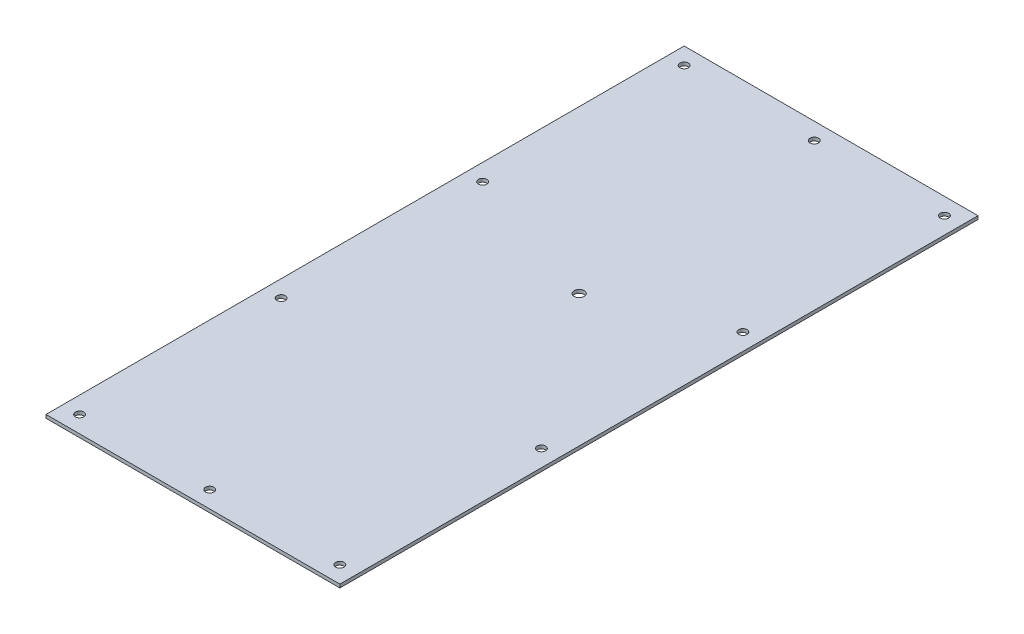
ISO-10303-21;
HEADER;
FILE_DESCRIPTION(('STEP AP214'),'2;1');
FILE_NAME('part.step','',(''),(''),'','','');
FILE_SCHEMA(('AUTOMOTIVE_DESIGN { 1 0 10303 214 1 1 1 1 }'));
ENDSEC;
DATA;
#1=APPLICATION_CONTEXT('core data for automotive mechanical design processes');
#2=APPLICATION_PROTOCOL_DEFINITION('international standard','automotive_design',2000,#1);
#3=PRODUCT_CONTEXT('',#1,'mechanical');
#4=PRODUCT('Part','Part','',(#3));
#5=PRODUCT_RELATED_PRODUCT_CATEGORY('part','',(#4));
#6=PRODUCT_DEFINITION_FORMATION('','',#4);
#7=PRODUCT_DEFINITION_CONTEXT('part definition',#1,'design');
#8=PRODUCT_DEFINITION('design','',#6,#7);
#9=PRODUCT_DEFINITION_SHAPE('','',#8);
#10=(LENGTH_UNIT() NAMED_UNIT(*) SI_UNIT(.MILLI.,.METRE.));
#11=(NAMED_UNIT(*) PLANE_ANGLE_UNIT() SI_UNIT($,.RADIAN.));
#12=(NAMED_UNIT(*) SI_UNIT($,.STERADIAN.) SOLID_ANGLE_UNIT());
#13=UNCERTAINTY_MEASURE_WITH_UNIT(LENGTH_MEASURE(1.E-05),#10,'distance_accuracy_value','');
#14=(GEOMETRIC_REPRESENTATION_CONTEXT(3) GLOBAL_UNCERTAINTY_ASSIGNED_CONTEXT((#13)) GLOBAL_UNIT_ASSIGNED_CONTEXT((#10,
#11,#12)) REPRESENTATION_CONTEXT('',''));
#15=CARTESIAN_POINT('',(0.,0.,0.));
#16=DIRECTION('',(0.,0.,1.));
#17=DIRECTION('',(1.,0.,0.));
#18=AXIS2_PLACEMENT_3D('',#15,#16,#17);
#19=CARTESIAN_POINT('',(0.,2.,0.));
#20=DIRECTION('',(0.,1.,0.));
#21=DIRECTION('',(0.,0.,1.));
#22=AXIS2_PLACEMENT_3D('',#19,#20,#21);
#23=PLANE('',#22);
#24=CARTESIAN_POINT('',(8.89694413375075,2.,-31.1063946306831));
#25=DIRECTION('',(0.,1.,0.));
#26=DIRECTION('',(0.,0.,1.));
#27=AXIS2_PLACEMENT_3D('',#24,#25,#26);
#28=CIRCLE('',#27,3.);
#29=CARTESIAN_POINT('',(8.89694413375075,2.,-28.1063946306831));
#30=VERTEX_POINT('',#29);
#31=EDGE_CURVE('E172',#30,#30,#28,.T.);
#32=ORIENTED_EDGE('',*,*,#31,.F.);
#33=EDGE_LOOP('',(#32));
#34=FACE_BOUND('',#33,.T.);
#35=CARTESIAN_POINT('',(-77.4999999999975,2.,60.));
#36=DIRECTION('',(0.,1.,0.));
#37=DIRECTION('',(0.,0.,1.));
#38=AXIS2_PLACEMENT_3D('',#35,#36,#37);
#39=CIRCLE('',#38,2.50000000000001);
#40=CARTESIAN_POINT('',(-77.4999999999975,2.,62.5));
#41=VERTEX_POINT('',#40);
#42=EDGE_CURVE('E157',#41,#41,#39,.T.);
#43=ORIENTED_EDGE('',*,*,#42,.F.);
#44=EDGE_LOOP('',(#43));
#45=FACE_BOUND('',#44,.T.);
#46=CARTESIAN_POINT('',(77.5000000000038,2.,180.));
#47=DIRECTION('',(0.,1.,0.));
#48=DIRECTION('',(0.,0.,1.));
#49=AXIS2_PLACEMENT_3D('',#46,#47,#48);
#50=CIRCLE('',#49,2.50000000000001);
#51=CARTESIAN_POINT('',(77.5000000000038,2.,182.5));
#52=VERTEX_POINT('',#51);
#53=EDGE_CURVE('E145',#52,#52,#50,.T.);
#54=ORIENTED_EDGE('',*,*,#53,.F.);
#55=EDGE_LOOP('',(#54));
#56=FACE_BOUND('',#55,.T.);
#57=CARTESIAN_POINT('',(77.5000000000026,2.,60.));
#58=DIRECTION('',(0.,1.,0.));
#59=DIRECTION('',(0.,0.,1.));
#60=AXIS2_PLACEMENT_3D('',#57,#58,#59);
#61=CIRCLE('',#60,2.50000000000001);
#62=CARTESIAN_POINT('',(77.5000000000026,2.,62.5));
#63=VERTEX_POINT('',#62);
#64=EDGE_CURVE('E133',#63,#63,#61,.T.);
#65=ORIENTED_EDGE('',*,*,#64,.F.);
#66=EDGE_LOOP('',(#65));
#67=FACE_BOUND('',#66,.T.);
#68=CARTESIAN_POINT('',(77.5,2.,-180.));
#69=DIRECTION('',(0.,1.,0.));
#70=DIRECTION('',(0.,0.,1.));
#71=AXIS2_PLACEMENT_3D('',#68,#69,#70);
#72=CIRCLE('',#71,2.50000000000001);
#73=CARTESIAN_POINT('',(77.5,2.,-177.5));
#74=VERTEX_POINT('',#73);
#75=EDGE_CURVE('E121',#74,#74,#72,.T.);
#76=ORIENTED_EDGE('',*,*,#75,.F.);
#77=EDGE_LOOP('',(#76));
#78=FACE_BOUND('',#77,.T.);
#79=CARTESIAN_POINT('',(-77.5,2.,-180.));
#80=DIRECTION('',(0.,1.,0.));
#81=DIRECTION('',(0.,0.,1.));
#82=AXIS2_PLACEMENT_3D('',#79,#80,#81);
#83=CIRCLE('',#82,2.50000000000001);
#84=CARTESIAN_POINT('',(-77.5,2.,-177.5));
#85=VERTEX_POINT('',#84);
#86=EDGE_CURVE('E100',#85,#85,#83,.T.);
#87=ORIENTED_EDGE('',*,*,#86,.F.);
#88=EDGE_LOOP('',(#87));
#89=FACE_BOUND('',#88,.T.);
#90=DIRECTION('',(0.,0.,1.));
#91=VECTOR('',#90,1.);
#92=CARTESIAN_POINT('',(-87.5,2.,190.));
#93=LINE('',#92,#91);
#94=CARTESIAN_POINT('',(-87.5,2.,-190.));
#95=VERTEX_POINT('',#94);
#96=CARTESIAN_POINT('',(-87.5,2.,190.));
#97=VERTEX_POINT('',#96);
#98=EDGE_CURVE('E85',#95,#97,#93,.T.);
#99=ORIENTED_EDGE('',*,*,#98,.T.);
#100=DIRECTION('',(1.,0.,0.));
#101=VECTOR('',#100,1.);
#102=CARTESIAN_POINT('',(87.5,2.,190.));
#103=LINE('',#102,#101);
#104=CARTESIAN_POINT('',(87.5,2.,190.));
#105=VERTEX_POINT('',#104);
#106=EDGE_CURVE('E80',#97,#105,#103,.T.);
#107=ORIENTED_EDGE('',*,*,#106,.T.);
#108=DIRECTION('',(0.,0.,-1.));
#109=VECTOR('',#108,1.);
#110=CARTESIAN_POINT('',(87.5,2.,190.));
#111=LINE('',#110,#109);
#112=CARTESIAN_POINT('',(87.5,2.,-190.));
#113=VERTEX_POINT('',#112);
#114=EDGE_CURVE('E83',#105,#113,#111,.T.);
#115=ORIENTED_EDGE('',*,*,#114,.T.);
#116=DIRECTION('',(-1.,0.,0.));
#117=VECTOR('',#116,1.);
#118=CARTESIAN_POINT('',(87.5,2.,-190.));
#119=LINE('',#118,#117);
#120=EDGE_CURVE('E50',#113,#95,#119,.T.);
#121=ORIENTED_EDGE('',*,*,#120,.T.);
#122=EDGE_LOOP('',(#99,#107,#115,#121));
#123=FACE_BOUND('',#122,.T.);
#124=CARTESIAN_POINT('',(0.,2.,-180.));
#125=DIRECTION('',(0.,1.,0.));
#126=DIRECTION('',(0.,0.,1.));
#127=AXIS2_PLACEMENT_3D('',#124,#125,#126);
#128=CIRCLE('',#127,2.50000000000001);
#129=CARTESIAN_POINT('',(0.,2.,-177.5));
#130=VERTEX_POINT('',#129);
#131=EDGE_CURVE('E115',#130,#130,#128,.T.);
#132=ORIENTED_EDGE('',*,*,#131,.F.);
#133=EDGE_LOOP('',(#132));
#134=FACE_BOUND('',#133,.T.);
#135=CARTESIAN_POINT('',(77.5000000000013,2.,-60.));
#136=DIRECTION('',(0.,1.,0.));
#137=DIRECTION('',(0.,0.,1.));
#138=AXIS2_PLACEMENT_3D('',#135,#136,#137);
#139=CIRCLE('',#138,2.50000000000001);
#140=CARTESIAN_POINT('',(77.5000000000013,2.,-57.5));
#141=VERTEX_POINT('',#140);
#142=EDGE_CURVE('E127',#141,#141,#139,.T.);
#143=ORIENTED_EDGE('',*,*,#142,.F.);
#144=EDGE_LOOP('',(#143));
#145=FACE_BOUND('',#144,.T.);
#146=CARTESIAN_POINT('',(3.80251385934116E-12,2.,180.));
#147=DIRECTION('',(0.,1.,0.));
#148=DIRECTION('',(0.,0.,1.));
#149=AXIS2_PLACEMENT_3D('',#146,#147,#148);
#150=CIRCLE('',#149,2.50000000000001);
#151=CARTESIAN_POINT('',(3.80251385934116E-12,2.,182.5));
#152=VERTEX_POINT('',#151);
#153=EDGE_CURVE('E139',#152,#152,#150,.T.);
#154=ORIENTED_EDGE('',*,*,#153,.F.);
#155=EDGE_LOOP('',(#154));
#156=FACE_BOUND('',#155,.T.);
#157=CARTESIAN_POINT('',(-77.4999999999987,2.,-60.));
#158=DIRECTION('',(0.,1.,0.));
#159=DIRECTION('',(0.,0.,1.));
#160=AXIS2_PLACEMENT_3D('',#157,#158,#159);
#161=CIRCLE('',#160,2.50000000000001);
#162=CARTESIAN_POINT('',(-77.4999999999987,2.,-57.5));
#163=VERTEX_POINT('',#162);
#164=EDGE_CURVE('E151',#163,#163,#161,.T.);
#165=ORIENTED_EDGE('',*,*,#164,.F.);
#166=EDGE_LOOP('',(#165));
#167=FACE_BOUND('',#166,.T.);
#168=CARTESIAN_POINT('',(-77.4999999999962,2.,180.));
#169=DIRECTION('',(0.,1.,0.));
#170=DIRECTION('',(0.,0.,1.));
#171=AXIS2_PLACEMENT_3D('',#168,#169,#170);
#172=CIRCLE('',#171,2.50000000000001);
#173=CARTESIAN_POINT('',(-77.4999999999962,2.,182.5));
#174=VERTEX_POINT('',#173);
#175=EDGE_CURVE('E163',#174,#174,#172,.T.);
#176=ORIENTED_EDGE('',*,*,#175,.F.);
#177=EDGE_LOOP('',(#176));
#178=FACE_BOUND('',#177,.T.);
#179=ADVANCED_FACE('F33',(#34,#45,#56,#67,#78,#89,#123,#134,#145,#156,#167,#178),#23,.T.);
#180=CARTESIAN_POINT('',(0.,0.,0.));
#181=DIRECTION('',(0.,1.,0.));
#182=DIRECTION('',(0.,0.,1.));
#183=AXIS2_PLACEMENT_3D('',#180,#181,#182);
#184=PLANE('',#183);
#185=CARTESIAN_POINT('',(8.89694413375075,0.,-31.1063946306831));
#186=DIRECTION('',(0.,1.,0.));
#187=DIRECTION('',(0.,0.,1.));
#188=AXIS2_PLACEMENT_3D('',#185,#186,#187);
#189=CIRCLE('',#188,3.);
#190=CARTESIAN_POINT('',(8.89694413375075,0.,-28.1063946306831));
#191=VERTEX_POINT('',#190);
#192=EDGE_CURVE('E169',#191,#191,#189,.T.);
#193=ORIENTED_EDGE('',*,*,#192,.T.);
#194=EDGE_LOOP('',(#193));
#195=FACE_BOUND('',#194,.T.);
#196=DIRECTION('',(0.,0.,1.));
#197=VECTOR('',#196,1.);
#198=CARTESIAN_POINT('',(-87.5,0.,190.));
#199=LINE('',#198,#197);
#200=CARTESIAN_POINT('',(-87.5,0.,-190.));
#201=VERTEX_POINT('',#200);
#202=CARTESIAN_POINT('',(-87.5,0.,190.));
#203=VERTEX_POINT('',#202);
#204=EDGE_CURVE('E97',#201,#203,#199,.T.);
#205=ORIENTED_EDGE('',*,*,#204,.F.);
#206=DIRECTION('',(-1.,0.,0.));
#207=VECTOR('',#206,1.);
#208=CARTESIAN_POINT('',(87.5,0.,-190.));
#209=LINE('',#208,#207);
#210=CARTESIAN_POINT('',(87.5,0.,-190.));
#211=VERTEX_POINT('',#210);
#212=EDGE_CURVE('E73',#211,#201,#209,.T.);
#213=ORIENTED_EDGE('',*,*,#212,.F.);
#214=DIRECTION('',(0.,0.,-1.));
#215=VECTOR('',#214,1.);
#216=CARTESIAN_POINT('',(87.5,0.,190.));
#217=LINE('',#216,#215);
#218=CARTESIAN_POINT('',(87.5,0.,190.));
#219=VERTEX_POINT('',#218);
#220=EDGE_CURVE('E67',#219,#211,#217,.T.);
#221=ORIENTED_EDGE('',*,*,#220,.F.);
#222=DIRECTION('',(1.,0.,0.));
#223=VECTOR('',#222,1.);
#224=CARTESIAN_POINT('',(87.5,0.,190.));
#225=LINE('',#224,#223);
#226=EDGE_CURVE('E89',#203,#219,#225,.T.);
#227=ORIENTED_EDGE('',*,*,#226,.F.);
#228=EDGE_LOOP('',(#205,#213,#221,#227));
#229=FACE_BOUND('',#228,.T.);
#230=CARTESIAN_POINT('',(-77.5,0.,-180.));
#231=DIRECTION('',(0.,1.,0.));
#232=DIRECTION('',(0.,0.,1.));
#233=AXIS2_PLACEMENT_3D('',#230,#231,#232);
#234=CIRCLE('',#233,2.50000000000001);
#235=CARTESIAN_POINT('',(-77.5,0.,-177.5));
#236=VERTEX_POINT('',#235);
#237=EDGE_CURVE('E112',#236,#236,#234,.T.);
#238=ORIENTED_EDGE('',*,*,#237,.T.);
#239=EDGE_LOOP('',(#238));
#240=FACE_BOUND('',#239,.T.);
#241=CARTESIAN_POINT('',(0.,0.,-180.));
#242=DIRECTION('',(0.,1.,0.));
#243=DIRECTION('',(0.,0.,1.));
#244=AXIS2_PLACEMENT_3D('',#241,#242,#243);
#245=CIRCLE('',#244,2.50000000000001);
#246=CARTESIAN_POINT('',(0.,0.,-177.5));
#247=VERTEX_POINT('',#246);
#248=EDGE_CURVE('E118',#247,#247,#245,.T.);
#249=ORIENTED_EDGE('',*,*,#248,.T.);
#250=EDGE_LOOP('',(#249));
#251=FACE_BOUND('',#250,.T.);
#252=CARTESIAN_POINT('',(77.5,0.,-180.));
#253=DIRECTION('',(0.,1.,0.));
#254=DIRECTION('',(0.,0.,1.));
#255=AXIS2_PLACEMENT_3D('',#252,#253,#254);
#256=CIRCLE('',#255,2.50000000000001);
#257=CARTESIAN_POINT('',(77.5,0.,-177.5));
#258=VERTEX_POINT('',#257);
#259=EDGE_CURVE('E124',#258,#258,#256,.T.);
#260=ORIENTED_EDGE('',*,*,#259,.T.);
#261=EDGE_LOOP('',(#260));
#262=FACE_BOUND('',#261,.T.);
#263=CARTESIAN_POINT('',(77.5000000000013,0.,-60.));
#264=DIRECTION('',(0.,1.,0.));
#265=DIRECTION('',(0.,0.,1.));
#266=AXIS2_PLACEMENT_3D('',#263,#264,#265);
#267=CIRCLE('',#266,2.50000000000001);
#268=CARTESIAN_POINT('',(77.5000000000013,0.,-57.5));
#269=VERTEX_POINT('',#268);
#270=EDGE_CURVE('E130',#269,#269,#267,.T.);
#271=ORIENTED_EDGE('',*,*,#270,.T.);
#272=EDGE_LOOP('',(#271));
#273=FACE_BOUND('',#272,.T.);
#274=CARTESIAN_POINT('',(77.5000000000026,0.,60.));
#275=DIRECTION('',(0.,1.,0.));
#276=DIRECTION('',(0.,0.,1.));
#277=AXIS2_PLACEMENT_3D('',#274,#275,#276);
#278=CIRCLE('',#277,2.50000000000001);
#279=CARTESIAN_POINT('',(77.5000000000026,0.,62.5));
#280=VERTEX_POINT('',#279);
#281=EDGE_CURVE('E136',#280,#280,#278,.T.);
#282=ORIENTED_EDGE('',*,*,#281,.T.);
#283=EDGE_LOOP('',(#282));
#284=FACE_BOUND('',#283,.T.);
#285=CARTESIAN_POINT('',(3.80251385934116E-12,0.,180.));
#286=DIRECTION('',(0.,1.,0.));
#287=DIRECTION('',(0.,0.,1.));
#288=AXIS2_PLACEMENT_3D('',#285,#286,#287);
#289=CIRCLE('',#288,2.50000000000001);
#290=CARTESIAN_POINT('',(3.80251385934116E-12,0.,182.5));
#291=VERTEX_POINT('',#290);
#292=EDGE_CURVE('E142',#291,#291,#289,.T.);
#293=ORIENTED_EDGE('',*,*,#292,.T.);
#294=EDGE_LOOP('',(#293));
#295=FACE_BOUND('',#294,.T.);
#296=CARTESIAN_POINT('',(77.5000000000038,0.,180.));
#297=DIRECTION('',(0.,1.,0.));
#298=DIRECTION('',(0.,0.,1.));
#299=AXIS2_PLACEMENT_3D('',#296,#297,#298);
#300=CIRCLE('',#299,2.50000000000001);
#301=CARTESIAN_POINT('',(77.5000000000038,0.,182.5));
#302=VERTEX_POINT('',#301);
#303=EDGE_CURVE('E148',#302,#302,#300,.T.);
#304=ORIENTED_EDGE('',*,*,#303,.T.);
#305=EDGE_LOOP('',(#304));
#306=FACE_BOUND('',#305,.T.);
#307=CARTESIAN_POINT('',(-77.4999999999987,0.,-60.));
#308=DIRECTION('',(0.,1.,0.));
#309=DIRECTION('',(0.,0.,1.));
#310=AXIS2_PLACEMENT_3D('',#307,#308,#309);
#311=CIRCLE('',#310,2.50000000000001);
#312=CARTESIAN_POINT('',(-77.4999999999987,0.,-57.5));
#313=VERTEX_POINT('',#312);
#314=EDGE_CURVE('E154',#313,#313,#311,.T.);
#315=ORIENTED_EDGE('',*,*,#314,.T.);
#316=EDGE_LOOP('',(#315));
#317=FACE_BOUND('',#316,.T.);
#318=CARTESIAN_POINT('',(-77.4999999999975,0.,60.));
#319=DIRECTION('',(0.,1.,0.));
#320=DIRECTION('',(0.,0.,1.));
#321=AXIS2_PLACEMENT_3D('',#318,#319,#320);
#322=CIRCLE('',#321,2.50000000000001);
#323=CARTESIAN_POINT('',(-77.4999999999975,0.,62.5));
#324=VERTEX_POINT('',#323);
#325=EDGE_CURVE('E160',#324,#324,#322,.T.);
#326=ORIENTED_EDGE('',*,*,#325,.T.);
#327=EDGE_LOOP('',(#326));
#328=FACE_BOUND('',#327,.T.);
#329=CARTESIAN_POINT('',(-77.4999999999962,0.,180.));
#330=DIRECTION('',(0.,1.,0.));
#331=DIRECTION('',(0.,0.,1.));
#332=AXIS2_PLACEMENT_3D('',#329,#330,#331);
#333=CIRCLE('',#332,2.50000000000001);
#334=CARTESIAN_POINT('',(-77.4999999999962,0.,182.5));
#335=VERTEX_POINT('',#334);
#336=EDGE_CURVE('E166',#335,#335,#333,.T.);
#337=ORIENTED_EDGE('',*,*,#336,.T.);
#338=EDGE_LOOP('',(#337));
#339=FACE_BOUND('',#338,.T.);
#340=ADVANCED_FACE('F108',(#195,#229,#240,#251,#262,#273,#284,#295,#306,#317,#328,#339),#184,.F.);
#341=CARTESIAN_POINT('',(-87.5,2.,190.));
#342=DIRECTION('',(1.,0.,0.));
#343=DIRECTION('',(0.,0.,-1.));
#344=AXIS2_PLACEMENT_3D('',#341,#342,#343);
#345=PLANE('',#344);
#346=ORIENTED_EDGE('',*,*,#204,.T.);
#347=DIRECTION('',(0.,-1.,0.));
#348=VECTOR('',#347,1.);
#349=CARTESIAN_POINT('',(-87.5,2.,190.));
#350=LINE('',#349,#348);
#351=EDGE_CURVE('E11',#97,#203,#350,.T.);
#352=ORIENTED_EDGE('',*,*,#351,.F.);
#353=ORIENTED_EDGE('',*,*,#98,.F.);
#354=DIRECTION('',(0.,-1.,0.));
#355=VECTOR('',#354,1.);
#356=CARTESIAN_POINT('',(-87.5,2.,-190.));
#357=LINE('',#356,#355);
#358=EDGE_CURVE('E93',#95,#201,#357,.T.);
#359=ORIENTED_EDGE('',*,*,#358,.T.);
#360=EDGE_LOOP('',(#346,#352,#353,#359));
#361=FACE_BOUND('',#360,.T.);
#362=ADVANCED_FACE('F35',(#361),#345,.F.);
#363=CARTESIAN_POINT('',(87.5,2.,190.));
#364=DIRECTION('',(0.,0.,-1.));
#365=DIRECTION('',(-1.,0.,0.));
#366=AXIS2_PLACEMENT_3D('',#363,#364,#365);
#367=PLANE('',#366);
#368=ORIENTED_EDGE('',*,*,#226,.T.);
#369=DIRECTION('',(0.,-1.,0.));
#370=VECTOR('',#369,1.);
#371=CARTESIAN_POINT('',(87.5,2.,190.));
#372=LINE('',#371,#370);
#373=EDGE_CURVE('E42',#105,#219,#372,.T.);
#374=ORIENTED_EDGE('',*,*,#373,.F.);
#375=ORIENTED_EDGE('',*,*,#106,.F.);
#376=ORIENTED_EDGE('',*,*,#351,.T.);
#377=EDGE_LOOP('',(#368,#374,#375,#376));
#378=FACE_BOUND('',#377,.T.);
#379=ADVANCED_FACE('F88',(#378),#367,.F.);
#380=CARTESIAN_POINT('',(87.5,2.,190.));
#381=DIRECTION('',(-1.,0.,0.));
#382=DIRECTION('',(0.,0.,1.));
#383=AXIS2_PLACEMENT_3D('',#380,#381,#382);
#384=PLANE('',#383);
#385=ORIENTED_EDGE('',*,*,#220,.T.);
#386=DIRECTION('',(0.,-1.,0.));
#387=VECTOR('',#386,1.);
#388=CARTESIAN_POINT('',(87.5,2.,-190.));
#389=LINE('',#388,#387);
#390=EDGE_CURVE('E90',#113,#211,#389,.T.);
#391=ORIENTED_EDGE('',*,*,#390,.F.);
#392=ORIENTED_EDGE('',*,*,#114,.F.);
#393=ORIENTED_EDGE('',*,*,#373,.T.);
#394=EDGE_LOOP('',(#385,#391,#392,#393));
#395=FACE_BOUND('',#394,.T.);
#396=ADVANCED_FACE('F91',(#395),#384,.F.);
#397=CARTESIAN_POINT('',(87.5,2.,-190.));
#398=DIRECTION('',(0.,0.,1.));
#399=DIRECTION('',(1.,0.,0.));
#400=AXIS2_PLACEMENT_3D('',#397,#398,#399);
#401=PLANE('',#400);
#402=ORIENTED_EDGE('',*,*,#212,.T.);
#403=ORIENTED_EDGE('',*,*,#358,.F.);
#404=ORIENTED_EDGE('',*,*,#120,.F.);
#405=ORIENTED_EDGE('',*,*,#390,.T.);
#406=EDGE_LOOP('',(#402,#403,#404,#405));
#407=FACE_BOUND('',#406,.T.);
#408=ADVANCED_FACE('F105',(#407),#401,.F.);
#409=CARTESIAN_POINT('',(-77.5,2.,-180.));
#410=DIRECTION('',(0.,-1.,0.));
#411=DIRECTION('',(0.,0.,-1.));
#412=AXIS2_PLACEMENT_3D('',#409,#410,#411);
#413=CYLINDRICAL_SURFACE('',#412,2.50000000000001);
#414=ORIENTED_EDGE('',*,*,#86,.T.);
#415=EDGE_LOOP('',(#414));
#416=FACE_BOUND('',#415,.T.);
#417=ORIENTED_EDGE('',*,*,#237,.F.);
#418=EDGE_LOOP('',(#417));
#419=FACE_BOUND('',#418,.T.);
#420=ADVANCED_FACE('F199',(#416,#419),#413,.F.);
#421=CARTESIAN_POINT('',(0.,2.,-180.));
#422=DIRECTION('',(0.,-1.,0.));
#423=DIRECTION('',(0.,0.,-1.));
#424=AXIS2_PLACEMENT_3D('',#421,#422,#423);
#425=CYLINDRICAL_SURFACE('',#424,2.50000000000001);
#426=ORIENTED_EDGE('',*,*,#131,.T.);
#427=EDGE_LOOP('',(#426));
#428=FACE_BOUND('',#427,.T.);
#429=ORIENTED_EDGE('',*,*,#248,.F.);
#430=EDGE_LOOP('',(#429));
#431=FACE_BOUND('',#430,.T.);
#432=ADVANCED_FACE('F202',(#428,#431),#425,.F.);
#433=CARTESIAN_POINT('',(77.5,2.,-180.));
#434=DIRECTION('',(0.,-1.,0.));
#435=DIRECTION('',(0.,0.,-1.));
#436=AXIS2_PLACEMENT_3D('',#433,#434,#435);
#437=CYLINDRICAL_SURFACE('',#436,2.50000000000001);
#438=ORIENTED_EDGE('',*,*,#75,.T.);
#439=EDGE_LOOP('',(#438));
#440=FACE_BOUND('',#439,.T.);
#441=ORIENTED_EDGE('',*,*,#259,.F.);
#442=EDGE_LOOP('',(#441));
#443=FACE_BOUND('',#442,.T.);
#444=ADVANCED_FACE('F255',(#440,#443),#437,.F.);
#445=CARTESIAN_POINT('',(77.5000000000013,2.,-60.));
#446=DIRECTION('',(0.,-1.,0.));
#447=DIRECTION('',(0.,0.,-1.));
#448=AXIS2_PLACEMENT_3D('',#445,#446,#447);
#449=CYLINDRICAL_SURFACE('',#448,2.50000000000001);
#450=ORIENTED_EDGE('',*,*,#142,.T.);
#451=EDGE_LOOP('',(#450));
#452=FACE_BOUND('',#451,.T.);
#453=ORIENTED_EDGE('',*,*,#270,.F.);
#454=EDGE_LOOP('',(#453));
#455=FACE_BOUND('',#454,.T.);
#456=ADVANCED_FACE('F251',(#452,#455),#449,.F.);
#457=CARTESIAN_POINT('',(77.5000000000026,2.,60.));
#458=DIRECTION('',(0.,-1.,0.));
#459=DIRECTION('',(0.,0.,-1.));
#460=AXIS2_PLACEMENT_3D('',#457,#458,#459);
#461=CYLINDRICAL_SURFACE('',#460,2.50000000000001);
#462=ORIENTED_EDGE('',*,*,#64,.T.);
#463=EDGE_LOOP('',(#462));
#464=FACE_BOUND('',#463,.T.);
#465=ORIENTED_EDGE('',*,*,#281,.F.);
#466=EDGE_LOOP('',(#465));
#467=FACE_BOUND('',#466,.T.);
#468=ADVANCED_FACE('F247',(#464,#467),#461,.F.);
#469=CARTESIAN_POINT('',(3.80251385934116E-12,2.,180.));
#470=DIRECTION('',(0.,-1.,0.));
#471=DIRECTION('',(0.,0.,-1.));
#472=AXIS2_PLACEMENT_3D('',#469,#470,#471);
#473=CYLINDRICAL_SURFACE('',#472,2.50000000000001);
#474=ORIENTED_EDGE('',*,*,#153,.T.);
#475=EDGE_LOOP('',(#474));
#476=FACE_BOUND('',#475,.T.);
#477=ORIENTED_EDGE('',*,*,#292,.F.);
#478=EDGE_LOOP('',(#477));
#479=FACE_BOUND('',#478,.T.);
#480=ADVANCED_FACE('F243',(#476,#479),#473,.F.);
#481=CARTESIAN_POINT('',(77.5000000000038,2.,180.));
#482=DIRECTION('',(0.,-1.,0.));
#483=DIRECTION('',(0.,0.,-1.));
#484=AXIS2_PLACEMENT_3D('',#481,#482,#483);
#485=CYLINDRICAL_SURFACE('',#484,2.50000000000001);
#486=ORIENTED_EDGE('',*,*,#53,.T.);
#487=EDGE_LOOP('',(#486));
#488=FACE_BOUND('',#487,.T.);
#489=ORIENTED_EDGE('',*,*,#303,.F.);
#490=EDGE_LOOP('',(#489));
#491=FACE_BOUND('',#490,.T.);
#492=ADVANCED_FACE('F239',(#488,#491),#485,.F.);
#493=CARTESIAN_POINT('',(-77.4999999999987,2.,-60.));
#494=DIRECTION('',(0.,-1.,0.));
#495=DIRECTION('',(0.,0.,-1.));
#496=AXIS2_PLACEMENT_3D('',#493,#494,#495);
#497=CYLINDRICAL_SURFACE('',#496,2.50000000000001);
#498=ORIENTED_EDGE('',*,*,#164,.T.);
#499=EDGE_LOOP('',(#498));
#500=FACE_BOUND('',#499,.T.);
#501=ORIENTED_EDGE('',*,*,#314,.F.);
#502=EDGE_LOOP('',(#501));
#503=FACE_BOUND('',#502,.T.);
#504=ADVANCED_FACE('F233',(#500,#503),#497,.F.);
#505=CARTESIAN_POINT('',(-77.4999999999975,2.,60.));
#506=DIRECTION('',(0.,-1.,0.));
#507=DIRECTION('',(0.,0.,-1.));
#508=AXIS2_PLACEMENT_3D('',#505,#506,#507);
#509=CYLINDRICAL_SURFACE('',#508,2.50000000000001);
#510=ORIENTED_EDGE('',*,*,#42,.T.);
#511=EDGE_LOOP('',(#510));
#512=FACE_BOUND('',#511,.T.);
#513=ORIENTED_EDGE('',*,*,#325,.F.);
#514=EDGE_LOOP('',(#513));
#515=FACE_BOUND('',#514,.T.);
#516=ADVANCED_FACE('F227',(#512,#515),#509,.F.);
#517=CARTESIAN_POINT('',(-77.4999999999962,2.,180.));
#518=DIRECTION('',(0.,-1.,0.));
#519=DIRECTION('',(0.,0.,-1.));
#520=AXIS2_PLACEMENT_3D('',#517,#518,#519);
#521=CYLINDRICAL_SURFACE('',#520,2.50000000000001);
#522=ORIENTED_EDGE('',*,*,#175,.T.);
#523=EDGE_LOOP('',(#522));
#524=FACE_BOUND('',#523,.T.);
#525=ORIENTED_EDGE('',*,*,#336,.F.);
#526=EDGE_LOOP('',(#525));
#527=FACE_BOUND('',#526,.T.);
#528=ADVANCED_FACE('F182',(#524,#527),#521,.F.);
#529=CARTESIAN_POINT('',(8.89694413375075,0.,-31.1063946306831));
#530=DIRECTION('',(0.,1.,0.));
#531=DIRECTION('',(0.,0.,1.));
#532=AXIS2_PLACEMENT_3D('',#529,#530,#531);
#533=CYLINDRICAL_SURFACE('',#532,3.);
#534=ORIENTED_EDGE('',*,*,#192,.F.);
#535=EDGE_LOOP('',(#534));
#536=FACE_BOUND('',#535,.T.);
#537=ORIENTED_EDGE('',*,*,#31,.T.);
#538=EDGE_LOOP('',(#537));
#539=FACE_BOUND('',#538,.T.);
#540=ADVANCED_FACE('F179',(#536,#539),#533,.F.);
#541=CLOSED_SHELL('',(#179,#340,#362,#379,#396,#408,#420,#432,#444,#456,#468,#480,#492,#504,
#516,#528,#540));
#542=MANIFOLD_SOLID_BREP('B2',#541);
#543=ADVANCED_BREP_SHAPE_REPRESENTATION('',(#18,#542),#14);
#544=SHAPE_DEFINITION_REPRESENTATION(#9,#543);
ENDSEC;
END-ISO-10303-21;
